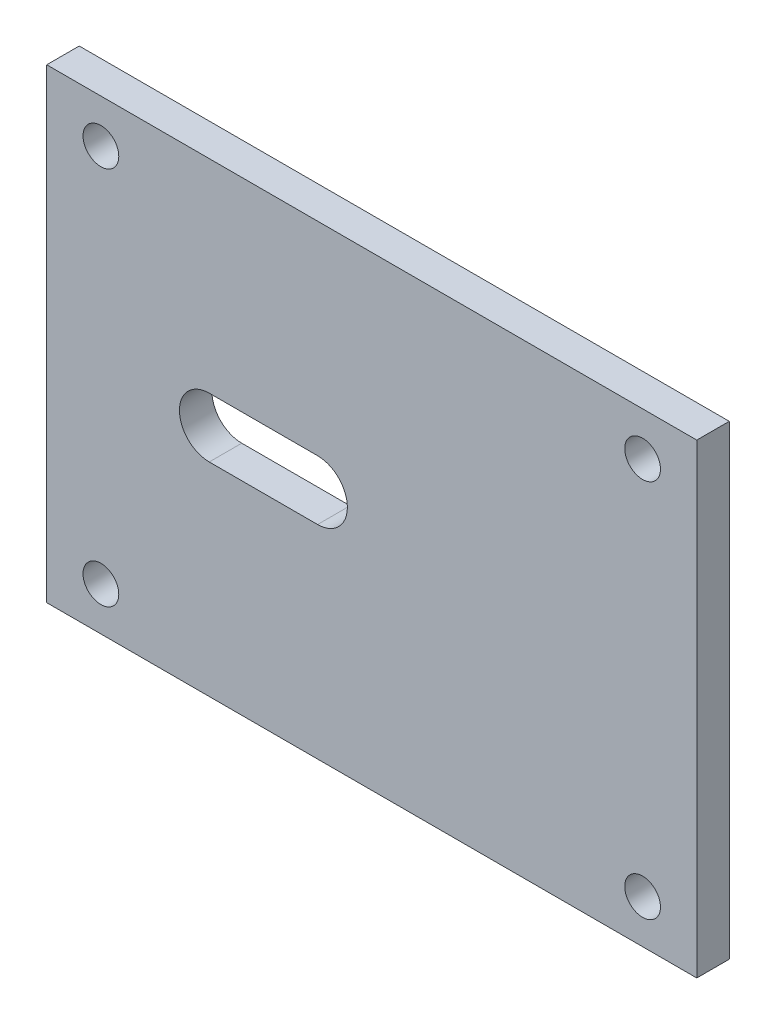
ISO-10303-21;
HEADER;
FILE_DESCRIPTION(('STEP AP214'),'2;1');
FILE_NAME('part.step','',(''),(''),'','','');
FILE_SCHEMA(('AUTOMOTIVE_DESIGN { 1 0 10303 214 1 1 1 1 }'));
ENDSEC;
DATA;
#1=APPLICATION_CONTEXT('core data for automotive mechanical design processes');
#2=APPLICATION_PROTOCOL_DEFINITION('international standard','automotive_design',2000,#1);
#3=PRODUCT_CONTEXT('',#1,'mechanical');
#4=PRODUCT('Part','Part','',(#3));
#5=PRODUCT_RELATED_PRODUCT_CATEGORY('part','',(#4));
#6=PRODUCT_DEFINITION_FORMATION('','',#4);
#7=PRODUCT_DEFINITION_CONTEXT('part definition',#1,'design');
#8=PRODUCT_DEFINITION('design','',#6,#7);
#9=PRODUCT_DEFINITION_SHAPE('','',#8);
#10=(LENGTH_UNIT() NAMED_UNIT(*) SI_UNIT(.MILLI.,.METRE.));
#11=(NAMED_UNIT(*) PLANE_ANGLE_UNIT() SI_UNIT($,.RADIAN.));
#12=(NAMED_UNIT(*) SI_UNIT($,.STERADIAN.) SOLID_ANGLE_UNIT());
#13=UNCERTAINTY_MEASURE_WITH_UNIT(LENGTH_MEASURE(1.E-05),#10,'distance_accuracy_value','');
#14=(GEOMETRIC_REPRESENTATION_CONTEXT(3) GLOBAL_UNCERTAINTY_ASSIGNED_CONTEXT((#13)) GLOBAL_UNIT_ASSIGNED_CONTEXT((#10,
#11,#12)) REPRESENTATION_CONTEXT('',''));
#15=CARTESIAN_POINT('',(0.,0.,0.));
#16=DIRECTION('',(0.,0.,1.));
#17=DIRECTION('',(1.,0.,0.));
#18=AXIS2_PLACEMENT_3D('',#15,#16,#17);
#19=CARTESIAN_POINT('',(0.,0.,3.));
#20=DIRECTION('',(0.,0.,1.));
#21=DIRECTION('',(1.,0.,0.));
#22=AXIS2_PLACEMENT_3D('',#19,#20,#21);
#23=PLANE('',#22);
#24=CARTESIAN_POINT('',(-15.,0.,3.));
#25=DIRECTION('',(0.,0.,-1.));
#26=DIRECTION('',(-1.,0.,0.));
#27=AXIS2_PLACEMENT_3D('',#24,#25,#26);
#28=CIRCLE('',#27,2.75);
#29=CARTESIAN_POINT('',(-15.,-2.75,3.));
#30=VERTEX_POINT('',#29);
#31=CARTESIAN_POINT('',(-15.,2.75,3.));
#32=VERTEX_POINT('',#31);
#33=EDGE_CURVE('E108',#30,#32,#28,.T.);
#34=ORIENTED_EDGE('',*,*,#33,.T.);
#35=DIRECTION('',(1.,0.,0.));
#36=VECTOR('',#35,1.);
#37=CARTESIAN_POINT('',(-15.,2.75,3.));
#38=LINE('',#37,#36);
#39=CARTESIAN_POINT('',(-5.,2.75,3.));
#40=VERTEX_POINT('',#39);
#41=EDGE_CURVE('E117',#32,#40,#38,.T.);
#42=ORIENTED_EDGE('',*,*,#41,.T.);
#43=CARTESIAN_POINT('',(-5.,0.,3.));
#44=DIRECTION('',(0.,0.,-1.));
#45=DIRECTION('',(-1.,0.,0.));
#46=AXIS2_PLACEMENT_3D('',#43,#44,#45);
#47=CIRCLE('',#46,2.75);
#48=CARTESIAN_POINT('',(-5.,-2.75,3.));
#49=VERTEX_POINT('',#48);
#50=EDGE_CURVE('E56',#40,#49,#47,.T.);
#51=ORIENTED_EDGE('',*,*,#50,.T.);
#52=DIRECTION('',(-1.,0.,0.));
#53=VECTOR('',#52,1.);
#54=CARTESIAN_POINT('',(-15.,-2.75,3.));
#55=LINE('',#54,#53);
#56=EDGE_CURVE('E114',#49,#30,#55,.T.);
#57=ORIENTED_EDGE('',*,*,#56,.T.);
#58=EDGE_LOOP('',(#34,#42,#51,#57));
#59=FACE_BOUND('',#58,.T.);
#60=CARTESIAN_POINT('',(25.,-17.5,3.));
#61=DIRECTION('',(0.,0.,1.));
#62=DIRECTION('',(1.,0.,0.));
#63=AXIS2_PLACEMENT_3D('',#60,#61,#62);
#64=CIRCLE('',#63,1.65);
#65=CARTESIAN_POINT('',(26.65,-17.5,3.));
#66=VERTEX_POINT('',#65);
#67=EDGE_CURVE('E148',#66,#66,#64,.T.);
#68=ORIENTED_EDGE('',*,*,#67,.F.);
#69=EDGE_LOOP('',(#68));
#70=FACE_BOUND('',#69,.T.);
#71=CARTESIAN_POINT('',(-25.,17.5,3.));
#72=DIRECTION('',(0.,0.,1.));
#73=DIRECTION('',(1.,0.,0.));
#74=AXIS2_PLACEMENT_3D('',#71,#72,#73);
#75=CIRCLE('',#74,1.65);
#76=CARTESIAN_POINT('',(-23.35,17.5,3.));
#77=VERTEX_POINT('',#76);
#78=EDGE_CURVE('E160',#77,#77,#75,.T.);
#79=ORIENTED_EDGE('',*,*,#78,.F.);
#80=EDGE_LOOP('',(#79));
#81=FACE_BOUND('',#80,.T.);
#82=DIRECTION('',(0.,-1.,0.));
#83=VECTOR('',#82,1.);
#84=CARTESIAN_POINT('',(-30.,-21.5,3.));
#85=LINE('',#84,#83);
#86=CARTESIAN_POINT('',(-30.,21.5,3.));
#87=VERTEX_POINT('',#86);
#88=CARTESIAN_POINT('',(-30.,-21.5,3.));
#89=VERTEX_POINT('',#88);
#90=EDGE_CURVE('E166',#87,#89,#85,.T.);
#91=ORIENTED_EDGE('',*,*,#90,.T.);
#92=DIRECTION('',(1.,0.,0.));
#93=VECTOR('',#92,1.);
#94=CARTESIAN_POINT('',(30.,-21.5,3.));
#95=LINE('',#94,#93);
#96=CARTESIAN_POINT('',(30.,-21.5,3.));
#97=VERTEX_POINT('',#96);
#98=EDGE_CURVE('E169',#89,#97,#95,.T.);
#99=ORIENTED_EDGE('',*,*,#98,.T.);
#100=DIRECTION('',(0.,1.,0.));
#101=VECTOR('',#100,1.);
#102=CARTESIAN_POINT('',(30.,-21.5,3.));
#103=LINE('',#102,#101);
#104=CARTESIAN_POINT('',(30.,21.5,3.));
#105=VERTEX_POINT('',#104);
#106=EDGE_CURVE('E172',#97,#105,#103,.T.);
#107=ORIENTED_EDGE('',*,*,#106,.T.);
#108=DIRECTION('',(-1.,0.,0.));
#109=VECTOR('',#108,1.);
#110=CARTESIAN_POINT('',(30.,21.5,3.));
#111=LINE('',#110,#109);
#112=EDGE_CURVE('E174',#105,#87,#111,.T.);
#113=ORIENTED_EDGE('',*,*,#112,.T.);
#114=EDGE_LOOP('',(#91,#99,#107,#113));
#115=FACE_BOUND('',#114,.T.);
#116=CARTESIAN_POINT('',(25.,17.5,3.));
#117=DIRECTION('',(0.,0.,1.));
#118=DIRECTION('',(1.,0.,0.));
#119=AXIS2_PLACEMENT_3D('',#116,#117,#118);
#120=CIRCLE('',#119,1.65);
#121=CARTESIAN_POINT('',(26.65,17.5,3.));
#122=VERTEX_POINT('',#121);
#123=EDGE_CURVE('E154',#122,#122,#120,.T.);
#124=ORIENTED_EDGE('',*,*,#123,.F.);
#125=EDGE_LOOP('',(#124));
#126=FACE_BOUND('',#125,.T.);
#127=CARTESIAN_POINT('',(-25.,-17.5,3.));
#128=DIRECTION('',(0.,0.,1.));
#129=DIRECTION('',(1.,0.,0.));
#130=AXIS2_PLACEMENT_3D('',#127,#128,#129);
#131=CIRCLE('',#130,1.65);
#132=CARTESIAN_POINT('',(-23.35,-17.5,3.));
#133=VERTEX_POINT('',#132);
#134=EDGE_CURVE('E142',#133,#133,#131,.T.);
#135=ORIENTED_EDGE('',*,*,#134,.F.);
#136=EDGE_LOOP('',(#135));
#137=FACE_BOUND('',#136,.T.);
#138=ADVANCED_FACE('F41',(#59,#70,#81,#115,#126,#137),#23,.T.);
#139=CARTESIAN_POINT('',(0.,0.,0.));
#140=DIRECTION('',(0.,0.,1.));
#141=DIRECTION('',(1.,0.,0.));
#142=AXIS2_PLACEMENT_3D('',#139,#140,#141);
#143=PLANE('',#142);
#144=DIRECTION('',(1.,0.,0.));
#145=VECTOR('',#144,1.);
#146=CARTESIAN_POINT('',(-15.,2.75,0.));
#147=LINE('',#146,#145);
#148=CARTESIAN_POINT('',(-15.,2.75,0.));
#149=VERTEX_POINT('',#148);
#150=CARTESIAN_POINT('',(-5.,2.75,0.));
#151=VERTEX_POINT('',#150);
#152=EDGE_CURVE('E132',#149,#151,#147,.T.);
#153=ORIENTED_EDGE('',*,*,#152,.F.);
#154=CARTESIAN_POINT('',(-15.,0.,0.));
#155=DIRECTION('',(0.,0.,-1.));
#156=DIRECTION('',(-1.,0.,0.));
#157=AXIS2_PLACEMENT_3D('',#154,#155,#156);
#158=CIRCLE('',#157,2.75);
#159=CARTESIAN_POINT('',(-15.,-2.75,0.));
#160=VERTEX_POINT('',#159);
#161=EDGE_CURVE('E64',#160,#149,#158,.T.);
#162=ORIENTED_EDGE('',*,*,#161,.F.);
#163=DIRECTION('',(-1.,0.,0.));
#164=VECTOR('',#163,1.);
#165=CARTESIAN_POINT('',(-15.,-2.75,0.));
#166=LINE('',#165,#164);
#167=CARTESIAN_POINT('',(-5.,-2.75,0.));
#168=VERTEX_POINT('',#167);
#169=EDGE_CURVE('E123',#168,#160,#166,.T.);
#170=ORIENTED_EDGE('',*,*,#169,.F.);
#171=CARTESIAN_POINT('',(-5.,0.,0.));
#172=DIRECTION('',(0.,0.,-1.));
#173=DIRECTION('',(-1.,0.,0.));
#174=AXIS2_PLACEMENT_3D('',#171,#172,#173);
#175=CIRCLE('',#174,2.75);
#176=EDGE_CURVE('E126',#151,#168,#175,.T.);
#177=ORIENTED_EDGE('',*,*,#176,.F.);
#178=EDGE_LOOP('',(#153,#162,#170,#177));
#179=FACE_BOUND('',#178,.T.);
#180=DIRECTION('',(0.,-1.,0.));
#181=VECTOR('',#180,1.);
#182=CARTESIAN_POINT('',(-30.,-21.5,0.));
#183=LINE('',#182,#181);
#184=CARTESIAN_POINT('',(-30.,21.5,0.));
#185=VERTEX_POINT('',#184);
#186=CARTESIAN_POINT('',(-30.,-21.5,0.));
#187=VERTEX_POINT('',#186);
#188=EDGE_CURVE('E163',#185,#187,#183,.T.);
#189=ORIENTED_EDGE('',*,*,#188,.F.);
#190=DIRECTION('',(-1.,0.,0.));
#191=VECTOR('',#190,1.);
#192=CARTESIAN_POINT('',(30.,21.5,0.));
#193=LINE('',#192,#191);
#194=CARTESIAN_POINT('',(30.,21.5,0.));
#195=VERTEX_POINT('',#194);
#196=EDGE_CURVE('E170',#195,#185,#193,.T.);
#197=ORIENTED_EDGE('',*,*,#196,.F.);
#198=DIRECTION('',(0.,1.,0.));
#199=VECTOR('',#198,1.);
#200=CARTESIAN_POINT('',(30.,-21.5,0.));
#201=LINE('',#200,#199);
#202=CARTESIAN_POINT('',(30.,-21.5,0.));
#203=VERTEX_POINT('',#202);
#204=EDGE_CURVE('E181',#203,#195,#201,.T.);
#205=ORIENTED_EDGE('',*,*,#204,.F.);
#206=DIRECTION('',(1.,0.,0.));
#207=VECTOR('',#206,1.);
#208=CARTESIAN_POINT('',(30.,-21.5,0.));
#209=LINE('',#208,#207);
#210=EDGE_CURVE('E179',#187,#203,#209,.T.);
#211=ORIENTED_EDGE('',*,*,#210,.F.);
#212=EDGE_LOOP('',(#189,#197,#205,#211));
#213=FACE_BOUND('',#212,.T.);
#214=CARTESIAN_POINT('',(-25.,17.5,0.));
#215=DIRECTION('',(0.,0.,1.));
#216=DIRECTION('',(1.,0.,0.));
#217=AXIS2_PLACEMENT_3D('',#214,#215,#216);
#218=CIRCLE('',#217,1.65);
#219=CARTESIAN_POINT('',(-23.35,17.5,0.));
#220=VERTEX_POINT('',#219);
#221=EDGE_CURVE('E157',#220,#220,#218,.T.);
#222=ORIENTED_EDGE('',*,*,#221,.T.);
#223=EDGE_LOOP('',(#222));
#224=FACE_BOUND('',#223,.T.);
#225=CARTESIAN_POINT('',(25.,17.5,0.));
#226=DIRECTION('',(0.,0.,1.));
#227=DIRECTION('',(1.,0.,0.));
#228=AXIS2_PLACEMENT_3D('',#225,#226,#227);
#229=CIRCLE('',#228,1.65);
#230=CARTESIAN_POINT('',(26.65,17.5,0.));
#231=VERTEX_POINT('',#230);
#232=EDGE_CURVE('E151',#231,#231,#229,.T.);
#233=ORIENTED_EDGE('',*,*,#232,.T.);
#234=EDGE_LOOP('',(#233));
#235=FACE_BOUND('',#234,.T.);
#236=CARTESIAN_POINT('',(25.,-17.5,0.));
#237=DIRECTION('',(0.,0.,1.));
#238=DIRECTION('',(1.,0.,0.));
#239=AXIS2_PLACEMENT_3D('',#236,#237,#238);
#240=CIRCLE('',#239,1.65);
#241=CARTESIAN_POINT('',(26.65,-17.5,0.));
#242=VERTEX_POINT('',#241);
#243=EDGE_CURVE('E145',#242,#242,#240,.T.);
#244=ORIENTED_EDGE('',*,*,#243,.T.);
#245=EDGE_LOOP('',(#244));
#246=FACE_BOUND('',#245,.T.);
#247=CARTESIAN_POINT('',(-25.,-17.5,0.));
#248=DIRECTION('',(0.,0.,1.));
#249=DIRECTION('',(1.,0.,0.));
#250=AXIS2_PLACEMENT_3D('',#247,#248,#249);
#251=CIRCLE('',#250,1.65);
#252=CARTESIAN_POINT('',(-23.35,-17.5,0.));
#253=VERTEX_POINT('',#252);
#254=EDGE_CURVE('E138',#253,#253,#251,.T.);
#255=ORIENTED_EDGE('',*,*,#254,.T.);
#256=EDGE_LOOP('',(#255));
#257=FACE_BOUND('',#256,.T.);
#258=ADVANCED_FACE('F199',(#179,#213,#224,#235,#246,#257),#143,.F.);
#259=CARTESIAN_POINT('',(-30.,-21.5,3.));
#260=DIRECTION('',(1.,0.,0.));
#261=DIRECTION('',(0.,0.,-1.));
#262=AXIS2_PLACEMENT_3D('',#259,#260,#261);
#263=PLANE('',#262);
#264=ORIENTED_EDGE('',*,*,#188,.T.);
#265=DIRECTION('',(0.,0.,-1.));
#266=VECTOR('',#265,1.);
#267=CARTESIAN_POINT('',(-30.,-21.5,3.));
#268=LINE('',#267,#266);
#269=EDGE_CURVE('E11',#89,#187,#268,.T.);
#270=ORIENTED_EDGE('',*,*,#269,.F.);
#271=ORIENTED_EDGE('',*,*,#90,.F.);
#272=DIRECTION('',(0.,0.,-1.));
#273=VECTOR('',#272,1.);
#274=CARTESIAN_POINT('',(-30.,21.5,3.));
#275=LINE('',#274,#273);
#276=EDGE_CURVE('E176',#87,#185,#275,.T.);
#277=ORIENTED_EDGE('',*,*,#276,.T.);
#278=EDGE_LOOP('',(#264,#270,#271,#277));
#279=FACE_BOUND('',#278,.T.);
#280=ADVANCED_FACE('F43',(#279),#263,.F.);
#281=CARTESIAN_POINT('',(30.,-21.5,3.));
#282=DIRECTION('',(0.,1.,0.));
#283=DIRECTION('',(-1.,0.,0.));
#284=AXIS2_PLACEMENT_3D('',#281,#282,#283);
#285=PLANE('',#284);
#286=ORIENTED_EDGE('',*,*,#210,.T.);
#287=DIRECTION('',(0.,0.,-1.));
#288=VECTOR('',#287,1.);
#289=CARTESIAN_POINT('',(30.,-21.5,3.));
#290=LINE('',#289,#288);
#291=EDGE_CURVE('E49',#97,#203,#290,.T.);
#292=ORIENTED_EDGE('',*,*,#291,.F.);
#293=ORIENTED_EDGE('',*,*,#98,.F.);
#294=ORIENTED_EDGE('',*,*,#269,.T.);
#295=EDGE_LOOP('',(#286,#292,#293,#294));
#296=FACE_BOUND('',#295,.T.);
#297=ADVANCED_FACE('F210',(#296),#285,.F.);
#298=CARTESIAN_POINT('',(30.,-21.5,3.));
#299=DIRECTION('',(-1.,0.,0.));
#300=DIRECTION('',(0.,0.,1.));
#301=AXIS2_PLACEMENT_3D('',#298,#299,#300);
#302=PLANE('',#301);
#303=ORIENTED_EDGE('',*,*,#204,.T.);
#304=DIRECTION('',(0.,0.,-1.));
#305=VECTOR('',#304,1.);
#306=CARTESIAN_POINT('',(30.,21.5,3.));
#307=LINE('',#306,#305);
#308=EDGE_CURVE('E186',#105,#195,#307,.T.);
#309=ORIENTED_EDGE('',*,*,#308,.F.);
#310=ORIENTED_EDGE('',*,*,#106,.F.);
#311=ORIENTED_EDGE('',*,*,#291,.T.);
#312=EDGE_LOOP('',(#303,#309,#310,#311));
#313=FACE_BOUND('',#312,.T.);
#314=ADVANCED_FACE('F193',(#313),#302,.F.);
#315=CARTESIAN_POINT('',(30.,21.5,3.));
#316=DIRECTION('',(0.,-1.,0.));
#317=DIRECTION('',(1.,0.,0.));
#318=AXIS2_PLACEMENT_3D('',#315,#316,#317);
#319=PLANE('',#318);
#320=ORIENTED_EDGE('',*,*,#196,.T.);
#321=ORIENTED_EDGE('',*,*,#276,.F.);
#322=ORIENTED_EDGE('',*,*,#112,.F.);
#323=ORIENTED_EDGE('',*,*,#308,.T.);
#324=EDGE_LOOP('',(#320,#321,#322,#323));
#325=FACE_BOUND('',#324,.T.);
#326=ADVANCED_FACE('F203',(#325),#319,.F.);
#327=CARTESIAN_POINT('',(-25.,17.5,3.));
#328=DIRECTION('',(0.,0.,-1.));
#329=DIRECTION('',(-1.,0.,0.));
#330=AXIS2_PLACEMENT_3D('',#327,#328,#329);
#331=CYLINDRICAL_SURFACE('',#330,1.65);
#332=ORIENTED_EDGE('',*,*,#78,.T.);
#333=EDGE_LOOP('',(#332));
#334=FACE_BOUND('',#333,.T.);
#335=ORIENTED_EDGE('',*,*,#221,.F.);
#336=EDGE_LOOP('',(#335));
#337=FACE_BOUND('',#336,.T.);
#338=ADVANCED_FACE('F226',(#334,#337),#331,.F.);
#339=CARTESIAN_POINT('',(25.,17.5,3.));
#340=DIRECTION('',(0.,0.,-1.));
#341=DIRECTION('',(-1.,0.,0.));
#342=AXIS2_PLACEMENT_3D('',#339,#340,#341);
#343=CYLINDRICAL_SURFACE('',#342,1.65);
#344=ORIENTED_EDGE('',*,*,#123,.T.);
#345=EDGE_LOOP('',(#344));
#346=FACE_BOUND('',#345,.T.);
#347=ORIENTED_EDGE('',*,*,#232,.F.);
#348=EDGE_LOOP('',(#347));
#349=FACE_BOUND('',#348,.T.);
#350=ADVANCED_FACE('F233',(#346,#349),#343,.F.);
#351=CARTESIAN_POINT('',(25.,-17.5,3.));
#352=DIRECTION('',(0.,0.,-1.));
#353=DIRECTION('',(-1.,0.,0.));
#354=AXIS2_PLACEMENT_3D('',#351,#352,#353);
#355=CYLINDRICAL_SURFACE('',#354,1.65);
#356=ORIENTED_EDGE('',*,*,#67,.T.);
#357=EDGE_LOOP('',(#356));
#358=FACE_BOUND('',#357,.T.);
#359=ORIENTED_EDGE('',*,*,#243,.F.);
#360=EDGE_LOOP('',(#359));
#361=FACE_BOUND('',#360,.T.);
#362=ADVANCED_FACE('F238',(#358,#361),#355,.F.);
#363=CARTESIAN_POINT('',(-25.,-17.5,3.));
#364=DIRECTION('',(0.,0.,-1.));
#365=DIRECTION('',(-1.,0.,0.));
#366=AXIS2_PLACEMENT_3D('',#363,#364,#365);
#367=CYLINDRICAL_SURFACE('',#366,1.65);
#368=ORIENTED_EDGE('',*,*,#134,.T.);
#369=EDGE_LOOP('',(#368));
#370=FACE_BOUND('',#369,.T.);
#371=ORIENTED_EDGE('',*,*,#254,.F.);
#372=EDGE_LOOP('',(#371));
#373=FACE_BOUND('',#372,.T.);
#374=ADVANCED_FACE('F250',(#370,#373),#367,.F.);
#375=CARTESIAN_POINT('',(-15.,0.,3.));
#376=DIRECTION('',(0.,0.,-1.));
#377=DIRECTION('',(-1.,0.,0.));
#378=AXIS2_PLACEMENT_3D('',#375,#376,#377);
#379=CYLINDRICAL_SURFACE('',#378,2.75);
#380=ORIENTED_EDGE('',*,*,#161,.T.);
#381=DIRECTION('',(0.,0.,-1.));
#382=VECTOR('',#381,1.);
#383=CARTESIAN_POINT('',(-15.,2.75,3.));
#384=LINE('',#383,#382);
#385=EDGE_CURVE('E104',#32,#149,#384,.T.);
#386=ORIENTED_EDGE('',*,*,#385,.F.);
#387=ORIENTED_EDGE('',*,*,#33,.F.);
#388=DIRECTION('',(0.,0.,-1.));
#389=VECTOR('',#388,1.);
#390=CARTESIAN_POINT('',(-15.,-2.75,3.));
#391=LINE('',#390,#389);
#392=EDGE_CURVE('E136',#30,#160,#391,.T.);
#393=ORIENTED_EDGE('',*,*,#392,.T.);
#394=EDGE_LOOP('',(#380,#386,#387,#393));
#395=FACE_BOUND('',#394,.T.);
#396=ADVANCED_FACE('F106',(#395),#379,.F.);
#397=CARTESIAN_POINT('',(-15.,-2.75,3.));
#398=DIRECTION('',(0.,-1.,0.));
#399=DIRECTION('',(1.,0.,0.));
#400=AXIS2_PLACEMENT_3D('',#397,#398,#399);
#401=PLANE('',#400);
#402=ORIENTED_EDGE('',*,*,#169,.T.);
#403=ORIENTED_EDGE('',*,*,#392,.F.);
#404=ORIENTED_EDGE('',*,*,#56,.F.);
#405=DIRECTION('',(0.,0.,-1.));
#406=VECTOR('',#405,1.);
#407=CARTESIAN_POINT('',(-5.,-2.75,3.));
#408=LINE('',#407,#406);
#409=EDGE_CURVE('E139',#49,#168,#408,.T.);
#410=ORIENTED_EDGE('',*,*,#409,.T.);
#411=EDGE_LOOP('',(#402,#403,#404,#410));
#412=FACE_BOUND('',#411,.T.);
#413=ADVANCED_FACE('F257',(#412),#401,.F.);
#414=CARTESIAN_POINT('',(-5.,0.,3.));
#415=DIRECTION('',(0.,0.,-1.));
#416=DIRECTION('',(-1.,0.,0.));
#417=AXIS2_PLACEMENT_3D('',#414,#415,#416);
#418=CYLINDRICAL_SURFACE('',#417,2.75);
#419=ORIENTED_EDGE('',*,*,#176,.T.);
#420=ORIENTED_EDGE('',*,*,#409,.F.);
#421=ORIENTED_EDGE('',*,*,#50,.F.);
#422=DIRECTION('',(0.,0.,-1.));
#423=VECTOR('',#422,1.);
#424=CARTESIAN_POINT('',(-5.,2.75,3.));
#425=LINE('',#424,#423);
#426=EDGE_CURVE('E113',#40,#151,#425,.T.);
#427=ORIENTED_EDGE('',*,*,#426,.T.);
#428=EDGE_LOOP('',(#419,#420,#421,#427));
#429=FACE_BOUND('',#428,.T.);
#430=ADVANCED_FACE('F264',(#429),#418,.F.);
#431=CARTESIAN_POINT('',(-15.,2.75,3.));
#432=DIRECTION('',(0.,1.,0.));
#433=DIRECTION('',(-1.,0.,0.));
#434=AXIS2_PLACEMENT_3D('',#431,#432,#433);
#435=PLANE('',#434);
#436=ORIENTED_EDGE('',*,*,#152,.T.);
#437=ORIENTED_EDGE('',*,*,#426,.F.);
#438=ORIENTED_EDGE('',*,*,#41,.F.);
#439=ORIENTED_EDGE('',*,*,#385,.T.);
#440=EDGE_LOOP('',(#436,#437,#438,#439));
#441=FACE_BOUND('',#440,.T.);
#442=ADVANCED_FACE('F118',(#441),#435,.F.);
#443=CLOSED_SHELL('',(#138,#258,#280,#297,#314,#326,#338,#350,#362,#374,#396,#413,#430,#442));
#444=MANIFOLD_SOLID_BREP('B2',#443);
#445=ADVANCED_BREP_SHAPE_REPRESENTATION('',(#18,#444),#14);
#446=SHAPE_DEFINITION_REPRESENTATION(#9,#445);
ENDSEC;
END-ISO-10303-21;
